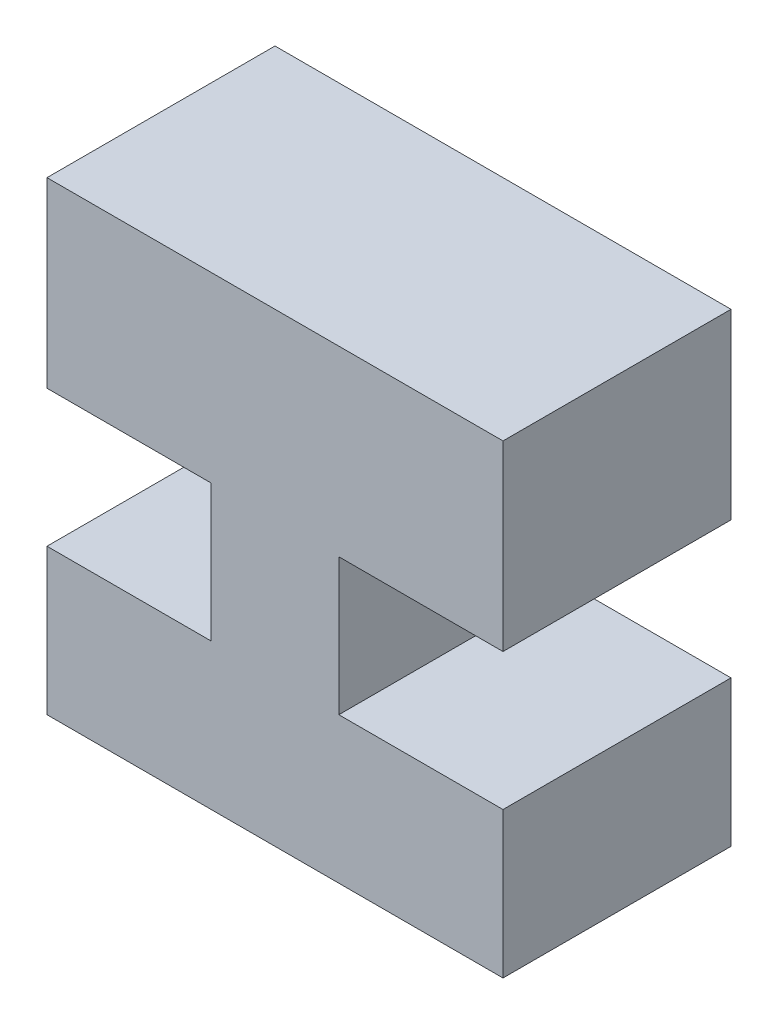
ISO-10303-21;
HEADER;
FILE_DESCRIPTION(('STEP AP214'),'2;1');
FILE_NAME('part.step','',(''),(''),'','','');
FILE_SCHEMA(('AUTOMOTIVE_DESIGN { 1 0 10303 214 1 1 1 1 }'));
ENDSEC;
DATA;
#1=APPLICATION_CONTEXT('core data for automotive mechanical design processes');
#2=APPLICATION_PROTOCOL_DEFINITION('international standard','automotive_design',2000,#1);
#3=PRODUCT_CONTEXT('',#1,'mechanical');
#4=PRODUCT('Part','Part','',(#3));
#5=PRODUCT_RELATED_PRODUCT_CATEGORY('part','',(#4));
#6=PRODUCT_DEFINITION_FORMATION('','',#4);
#7=PRODUCT_DEFINITION_CONTEXT('part definition',#1,'design');
#8=PRODUCT_DEFINITION('design','',#6,#7);
#9=PRODUCT_DEFINITION_SHAPE('','',#8);
#10=(LENGTH_UNIT() NAMED_UNIT(*) SI_UNIT(.MILLI.,.METRE.));
#11=(NAMED_UNIT(*) PLANE_ANGLE_UNIT() SI_UNIT($,.RADIAN.));
#12=(NAMED_UNIT(*) SI_UNIT($,.STERADIAN.) SOLID_ANGLE_UNIT());
#13=UNCERTAINTY_MEASURE_WITH_UNIT(LENGTH_MEASURE(1.E-05),#10,'distance_accuracy_value','');
#14=(GEOMETRIC_REPRESENTATION_CONTEXT(3) GLOBAL_UNCERTAINTY_ASSIGNED_CONTEXT((#13)) GLOBAL_UNIT_ASSIGNED_CONTEXT((#10,
#11,#12)) REPRESENTATION_CONTEXT('',''));
#15=CARTESIAN_POINT('',(0.,0.,0.));
#16=DIRECTION('',(0.,0.,1.));
#17=DIRECTION('',(1.,0.,0.));
#18=AXIS2_PLACEMENT_3D('',#15,#16,#17);
#19=CARTESIAN_POINT('',(12.7,-12.954,6.35));
#20=DIRECTION('',(0.,1.,0.));
#21=DIRECTION('',(0.,0.,1.));
#22=AXIS2_PLACEMENT_3D('',#19,#20,#21);
#23=PLANE('',#22);
#24=CARTESIAN_POINT('',(6.35,-12.954,3.175));
#25=DIRECTION('',(0.,1.,0.));
#26=DIRECTION('',(0.,0.,1.));
#27=AXIS2_PLACEMENT_3D('',#24,#25,#26);
#28=CIRCLE('',#27,2.37716033165933);
#29=CARTESIAN_POINT('',(6.35,-12.954,5.55216033165933));
#30=VERTEX_POINT('',#29);
#31=EDGE_CURVE('E11',#30,#30,#28,.T.);
#32=ORIENTED_EDGE('',*,*,#31,.T.);
#33=EDGE_LOOP('',(#32));
#34=FACE_BOUND('',#33,.T.);
#35=DIRECTION('',(1.,0.,0.));
#36=VECTOR('',#35,1.);
#37=CARTESIAN_POINT('',(12.7,-12.954,0.));
#38=LINE('',#37,#36);
#39=CARTESIAN_POINT('',(0.,-12.954,0.));
#40=VERTEX_POINT('',#39);
#41=CARTESIAN_POINT('',(12.7,-12.954,0.));
#42=VERTEX_POINT('',#41);
#43=EDGE_CURVE('E166',#40,#42,#38,.T.);
#44=ORIENTED_EDGE('',*,*,#43,.T.);
#45=DIRECTION('',(0.,0.,-1.));
#46=VECTOR('',#45,1.);
#47=CARTESIAN_POINT('',(12.7,-12.954,6.35));
#48=LINE('',#47,#46);
#49=CARTESIAN_POINT('',(12.7,-12.954,6.35));
#50=VERTEX_POINT('',#49);
#51=EDGE_CURVE('E187',#50,#42,#48,.T.);
#52=ORIENTED_EDGE('',*,*,#51,.F.);
#53=DIRECTION('',(1.,0.,0.));
#54=VECTOR('',#53,1.);
#55=CARTESIAN_POINT('',(12.7,-12.954,6.35));
#56=LINE('',#55,#54);
#57=CARTESIAN_POINT('',(0.,-12.954,6.35));
#58=VERTEX_POINT('',#57);
#59=EDGE_CURVE('E225',#58,#50,#56,.T.);
#60=ORIENTED_EDGE('',*,*,#59,.F.);
#61=DIRECTION('',(0.,0.,-1.));
#62=VECTOR('',#61,1.);
#63=CARTESIAN_POINT('',(0.,-12.954,6.35));
#64=LINE('',#63,#62);
#65=EDGE_CURVE('E190',#58,#40,#64,.T.);
#66=ORIENTED_EDGE('',*,*,#65,.T.);
#67=EDGE_LOOP('',(#44,#52,#60,#66));
#68=FACE_BOUND('',#67,.T.);
#69=ADVANCED_FACE('F32',(#34,#68),#23,.F.);
#70=CARTESIAN_POINT('',(0.,-5.08,6.35));
#71=DIRECTION('',(1.,0.,0.));
#72=DIRECTION('',(0.,0.,-1.));
#73=AXIS2_PLACEMENT_3D('',#70,#71,#72);
#74=PLANE('',#73);
#75=DIRECTION('',(0.,-1.,0.));
#76=VECTOR('',#75,1.);
#77=CARTESIAN_POINT('',(0.,-5.08,0.));
#78=LINE('',#77,#76);
#79=CARTESIAN_POINT('',(0.,0.,0.));
#80=VERTEX_POINT('',#79);
#81=CARTESIAN_POINT('',(0.,-5.08,0.));
#82=VERTEX_POINT('',#81);
#83=EDGE_CURVE('E154',#80,#82,#78,.T.);
#84=ORIENTED_EDGE('',*,*,#83,.T.);
#85=DIRECTION('',(0.,0.,-1.));
#86=VECTOR('',#85,1.);
#87=CARTESIAN_POINT('',(0.,-5.08,6.35));
#88=LINE('',#87,#86);
#89=CARTESIAN_POINT('',(0.,-5.08,6.35));
#90=VERTEX_POINT('',#89);
#91=EDGE_CURVE('E41',#90,#82,#88,.T.);
#92=ORIENTED_EDGE('',*,*,#91,.F.);
#93=DIRECTION('',(0.,-1.,0.));
#94=VECTOR('',#93,1.);
#95=CARTESIAN_POINT('',(0.,-5.08,6.35));
#96=LINE('',#95,#94);
#97=CARTESIAN_POINT('',(0.,0.,6.35));
#98=VERTEX_POINT('',#97);
#99=EDGE_CURVE('E177',#98,#90,#96,.T.);
#100=ORIENTED_EDGE('',*,*,#99,.F.);
#101=DIRECTION('',(0.,0.,-1.));
#102=VECTOR('',#101,1.);
#103=CARTESIAN_POINT('',(0.,0.,6.35));
#104=LINE('',#103,#102);
#105=EDGE_CURVE('E150',#98,#80,#104,.T.);
#106=ORIENTED_EDGE('',*,*,#105,.T.);
#107=EDGE_LOOP('',(#84,#92,#100,#106));
#108=FACE_BOUND('',#107,.T.);
#109=ADVANCED_FACE('F206',(#108),#74,.F.);
#110=CARTESIAN_POINT('',(4.572,-5.08,6.35));
#111=DIRECTION('',(0.,1.,0.));
#112=DIRECTION('',(-1.,0.,0.));
#113=AXIS2_PLACEMENT_3D('',#110,#111,#112);
#114=PLANE('',#113);
#115=DIRECTION('',(1.,0.,0.));
#116=VECTOR('',#115,1.);
#117=CARTESIAN_POINT('',(4.572,-5.08,0.));
#118=LINE('',#117,#116);
#119=CARTESIAN_POINT('',(4.572,-5.08,0.));
#120=VERTEX_POINT('',#119);
#121=EDGE_CURVE('E157',#82,#120,#118,.T.);
#122=ORIENTED_EDGE('',*,*,#121,.T.);
#123=DIRECTION('',(0.,0.,-1.));
#124=VECTOR('',#123,1.);
#125=CARTESIAN_POINT('',(4.572,-5.08,6.35));
#126=LINE('',#125,#124);
#127=CARTESIAN_POINT('',(4.572,-5.08,6.35));
#128=VERTEX_POINT('',#127);
#129=EDGE_CURVE('E199',#128,#120,#126,.T.);
#130=ORIENTED_EDGE('',*,*,#129,.F.);
#131=DIRECTION('',(1.,0.,0.));
#132=VECTOR('',#131,1.);
#133=CARTESIAN_POINT('',(4.572,-5.08,6.35));
#134=LINE('',#133,#132);
#135=EDGE_CURVE('E105',#90,#128,#134,.T.);
#136=ORIENTED_EDGE('',*,*,#135,.F.);
#137=ORIENTED_EDGE('',*,*,#91,.T.);
#138=EDGE_LOOP('',(#122,#130,#136,#137));
#139=FACE_BOUND('',#138,.T.);
#140=ADVANCED_FACE('F202',(#139),#114,.F.);
#141=CARTESIAN_POINT('',(4.572,-8.89,6.35));
#142=DIRECTION('',(1.,0.,0.));
#143=DIRECTION('',(0.,0.,-1.));
#144=AXIS2_PLACEMENT_3D('',#141,#142,#143);
#145=PLANE('',#144);
#146=DIRECTION('',(0.,-1.,0.));
#147=VECTOR('',#146,1.);
#148=CARTESIAN_POINT('',(4.572,-8.89,0.));
#149=LINE('',#148,#147);
#150=CARTESIAN_POINT('',(4.572,-8.89,0.));
#151=VERTEX_POINT('',#150);
#152=EDGE_CURVE('E160',#120,#151,#149,.T.);
#153=ORIENTED_EDGE('',*,*,#152,.T.);
#154=DIRECTION('',(0.,0.,-1.));
#155=VECTOR('',#154,1.);
#156=CARTESIAN_POINT('',(4.572,-8.89,6.35));
#157=LINE('',#156,#155);
#158=CARTESIAN_POINT('',(4.572,-8.89,6.35));
#159=VERTEX_POINT('',#158);
#160=EDGE_CURVE('E196',#159,#151,#157,.T.);
#161=ORIENTED_EDGE('',*,*,#160,.F.);
#162=DIRECTION('',(0.,-1.,0.));
#163=VECTOR('',#162,1.);
#164=CARTESIAN_POINT('',(4.572,-8.89,6.35));
#165=LINE('',#164,#163);
#166=EDGE_CURVE('E223',#128,#159,#165,.T.);
#167=ORIENTED_EDGE('',*,*,#166,.F.);
#168=ORIENTED_EDGE('',*,*,#129,.T.);
#169=EDGE_LOOP('',(#153,#161,#167,#168));
#170=FACE_BOUND('',#169,.T.);
#171=ADVANCED_FACE('F214',(#170),#145,.F.);
#172=CARTESIAN_POINT('',(0.,-8.89,6.35));
#173=DIRECTION('',(0.,-1.,0.));
#174=DIRECTION('',(0.,0.,-1.));
#175=AXIS2_PLACEMENT_3D('',#172,#173,#174);
#176=PLANE('',#175);
#177=DIRECTION('',(-1.,0.,0.));
#178=VECTOR('',#177,1.);
#179=CARTESIAN_POINT('',(0.,-8.89,0.));
#180=LINE('',#179,#178);
#181=CARTESIAN_POINT('',(0.,-8.89,0.));
#182=VERTEX_POINT('',#181);
#183=EDGE_CURVE('E162',#151,#182,#180,.T.);
#184=ORIENTED_EDGE('',*,*,#183,.T.);
#185=DIRECTION('',(0.,0.,-1.));
#186=VECTOR('',#185,1.);
#187=CARTESIAN_POINT('',(0.,-8.89,6.35));
#188=LINE('',#187,#186);
#189=CARTESIAN_POINT('',(0.,-8.89,6.35));
#190=VERTEX_POINT('',#189);
#191=EDGE_CURVE('E193',#190,#182,#188,.T.);
#192=ORIENTED_EDGE('',*,*,#191,.F.);
#193=DIRECTION('',(-1.,0.,0.));
#194=VECTOR('',#193,1.);
#195=CARTESIAN_POINT('',(0.,-8.89,6.35));
#196=LINE('',#195,#194);
#197=EDGE_CURVE('E220',#159,#190,#196,.T.);
#198=ORIENTED_EDGE('',*,*,#197,.F.);
#199=ORIENTED_EDGE('',*,*,#160,.T.);
#200=EDGE_LOOP('',(#184,#192,#198,#199));
#201=FACE_BOUND('',#200,.T.);
#202=ADVANCED_FACE('F218',(#201),#176,.F.);
#203=CARTESIAN_POINT('',(0.,-12.954,6.35));
#204=DIRECTION('',(1.,0.,0.));
#205=DIRECTION('',(0.,1.,0.));
#206=AXIS2_PLACEMENT_3D('',#203,#204,#205);
#207=PLANE('',#206);
#208=DIRECTION('',(0.,-1.,0.));
#209=VECTOR('',#208,1.);
#210=CARTESIAN_POINT('',(0.,-12.954,0.));
#211=LINE('',#210,#209);
#212=EDGE_CURVE('E164',#182,#40,#211,.T.);
#213=ORIENTED_EDGE('',*,*,#212,.T.);
#214=ORIENTED_EDGE('',*,*,#65,.F.);
#215=DIRECTION('',(0.,-1.,0.));
#216=VECTOR('',#215,1.);
#217=CARTESIAN_POINT('',(0.,-12.954,6.35));
#218=LINE('',#217,#216);
#219=EDGE_CURVE('E222',#190,#58,#218,.T.);
#220=ORIENTED_EDGE('',*,*,#219,.F.);
#221=ORIENTED_EDGE('',*,*,#191,.T.);
#222=EDGE_LOOP('',(#213,#214,#220,#221));
#223=FACE_BOUND('',#222,.T.);
#224=ADVANCED_FACE('F253',(#223),#207,.F.);
#225=CARTESIAN_POINT('',(12.7,-8.89,6.35));
#226=DIRECTION('',(-1.,0.,0.));
#227=DIRECTION('',(0.,-1.,0.));
#228=AXIS2_PLACEMENT_3D('',#225,#226,#227);
#229=PLANE('',#228);
#230=DIRECTION('',(0.,1.,0.));
#231=VECTOR('',#230,1.);
#232=CARTESIAN_POINT('',(12.7,-8.89,0.));
#233=LINE('',#232,#231);
#234=CARTESIAN_POINT('',(12.7,-8.89,0.));
#235=VERTEX_POINT('',#234);
#236=EDGE_CURVE('E168',#42,#235,#233,.T.);
#237=ORIENTED_EDGE('',*,*,#236,.T.);
#238=DIRECTION('',(0.,0.,-1.));
#239=VECTOR('',#238,1.);
#240=CARTESIAN_POINT('',(12.7,-8.89,6.35));
#241=LINE('',#240,#239);
#242=CARTESIAN_POINT('',(12.7,-8.89,6.35));
#243=VERTEX_POINT('',#242);
#244=EDGE_CURVE('E184',#243,#235,#241,.T.);
#245=ORIENTED_EDGE('',*,*,#244,.F.);
#246=DIRECTION('',(0.,1.,0.));
#247=VECTOR('',#246,1.);
#248=CARTESIAN_POINT('',(12.7,-8.89,6.35));
#249=LINE('',#248,#247);
#250=EDGE_CURVE('E231',#50,#243,#249,.T.);
#251=ORIENTED_EDGE('',*,*,#250,.F.);
#252=ORIENTED_EDGE('',*,*,#51,.T.);
#253=EDGE_LOOP('',(#237,#245,#251,#252));
#254=FACE_BOUND('',#253,.T.);
#255=ADVANCED_FACE('F247',(#254),#229,.F.);
#256=CARTESIAN_POINT('',(8.128,-8.89,6.35));
#257=DIRECTION('',(0.,-1.,0.));
#258=DIRECTION('',(0.,0.,-1.));
#259=AXIS2_PLACEMENT_3D('',#256,#257,#258);
#260=PLANE('',#259);
#261=DIRECTION('',(-1.,0.,0.));
#262=VECTOR('',#261,1.);
#263=CARTESIAN_POINT('',(8.128,-8.89,0.));
#264=LINE('',#263,#262);
#265=CARTESIAN_POINT('',(8.128,-8.89,0.));
#266=VERTEX_POINT('',#265);
#267=EDGE_CURVE('E170',#235,#266,#264,.T.);
#268=ORIENTED_EDGE('',*,*,#267,.T.);
#269=DIRECTION('',(0.,0.,-1.));
#270=VECTOR('',#269,1.);
#271=CARTESIAN_POINT('',(8.128,-8.89,6.35));
#272=LINE('',#271,#270);
#273=CARTESIAN_POINT('',(8.128,-8.89,6.35));
#274=VERTEX_POINT('',#273);
#275=EDGE_CURVE('E181',#274,#266,#272,.T.);
#276=ORIENTED_EDGE('',*,*,#275,.F.);
#277=DIRECTION('',(-1.,0.,0.));
#278=VECTOR('',#277,1.);
#279=CARTESIAN_POINT('',(8.128,-8.89,6.35));
#280=LINE('',#279,#278);
#281=EDGE_CURVE('E233',#243,#274,#280,.T.);
#282=ORIENTED_EDGE('',*,*,#281,.F.);
#283=ORIENTED_EDGE('',*,*,#244,.T.);
#284=EDGE_LOOP('',(#268,#276,#282,#283));
#285=FACE_BOUND('',#284,.T.);
#286=ADVANCED_FACE('F239',(#285),#260,.F.);
#287=CARTESIAN_POINT('',(8.128,-5.08,6.35));
#288=DIRECTION('',(-1.,0.,0.));
#289=DIRECTION('',(0.,0.,1.));
#290=AXIS2_PLACEMENT_3D('',#287,#288,#289);
#291=PLANE('',#290);
#292=DIRECTION('',(0.,1.,0.));
#293=VECTOR('',#292,1.);
#294=CARTESIAN_POINT('',(8.128,-5.08,0.));
#295=LINE('',#294,#293);
#296=CARTESIAN_POINT('',(8.128,-5.08,0.));
#297=VERTEX_POINT('',#296);
#298=EDGE_CURVE('E172',#266,#297,#295,.T.);
#299=ORIENTED_EDGE('',*,*,#298,.T.);
#300=DIRECTION('',(0.,0.,-1.));
#301=VECTOR('',#300,1.);
#302=CARTESIAN_POINT('',(8.128,-5.08,6.35));
#303=LINE('',#302,#301);
#304=CARTESIAN_POINT('',(8.128,-5.08,6.35));
#305=VERTEX_POINT('',#304);
#306=EDGE_CURVE('E145',#305,#297,#303,.T.);
#307=ORIENTED_EDGE('',*,*,#306,.F.);
#308=DIRECTION('',(0.,1.,0.));
#309=VECTOR('',#308,1.);
#310=CARTESIAN_POINT('',(8.128,-5.08,6.35));
#311=LINE('',#310,#309);
#312=EDGE_CURVE('E136',#274,#305,#311,.T.);
#313=ORIENTED_EDGE('',*,*,#312,.F.);
#314=ORIENTED_EDGE('',*,*,#275,.T.);
#315=EDGE_LOOP('',(#299,#307,#313,#314));
#316=FACE_BOUND('',#315,.T.);
#317=ADVANCED_FACE('F243',(#316),#291,.F.);
#318=CARTESIAN_POINT('',(12.7,-5.08,6.35));
#319=DIRECTION('',(0.,1.,0.));
#320=DIRECTION('',(-1.,0.,0.));
#321=AXIS2_PLACEMENT_3D('',#318,#319,#320);
#322=PLANE('',#321);
#323=DIRECTION('',(1.,0.,0.));
#324=VECTOR('',#323,1.);
#325=CARTESIAN_POINT('',(12.7,-5.08,0.));
#326=LINE('',#325,#324);
#327=CARTESIAN_POINT('',(12.7,-5.08,0.));
#328=VERTEX_POINT('',#327);
#329=EDGE_CURVE('E144',#297,#328,#326,.T.);
#330=ORIENTED_EDGE('',*,*,#329,.T.);
#331=DIRECTION('',(0.,0.,-1.));
#332=VECTOR('',#331,1.);
#333=CARTESIAN_POINT('',(12.7,-5.08,6.35));
#334=LINE('',#333,#332);
#335=CARTESIAN_POINT('',(12.7,-5.08,6.35));
#336=VERTEX_POINT('',#335);
#337=EDGE_CURVE('E141',#336,#328,#334,.T.);
#338=ORIENTED_EDGE('',*,*,#337,.F.);
#339=DIRECTION('',(1.,0.,0.));
#340=VECTOR('',#339,1.);
#341=CARTESIAN_POINT('',(12.7,-5.08,6.35));
#342=LINE('',#341,#340);
#343=EDGE_CURVE('E130',#305,#336,#342,.T.);
#344=ORIENTED_EDGE('',*,*,#343,.F.);
#345=ORIENTED_EDGE('',*,*,#306,.T.);
#346=EDGE_LOOP('',(#330,#338,#344,#345));
#347=FACE_BOUND('',#346,.T.);
#348=ADVANCED_FACE('F142',(#347),#322,.F.);
#349=CARTESIAN_POINT('',(12.7,0.,6.35));
#350=DIRECTION('',(-1.,0.,0.));
#351=DIRECTION('',(0.,0.,1.));
#352=AXIS2_PLACEMENT_3D('',#349,#350,#351);
#353=PLANE('',#352);
#354=DIRECTION('',(0.,1.,0.));
#355=VECTOR('',#354,1.);
#356=CARTESIAN_POINT('',(12.7,0.,0.));
#357=LINE('',#356,#355);
#358=CARTESIAN_POINT('',(12.7,0.,0.));
#359=VERTEX_POINT('',#358);
#360=EDGE_CURVE('E90',#328,#359,#357,.T.);
#361=ORIENTED_EDGE('',*,*,#360,.T.);
#362=DIRECTION('',(0.,0.,-1.));
#363=VECTOR('',#362,1.);
#364=CARTESIAN_POINT('',(12.7,0.,6.35));
#365=LINE('',#364,#363);
#366=CARTESIAN_POINT('',(12.7,0.,6.35));
#367=VERTEX_POINT('',#366);
#368=EDGE_CURVE('E146',#367,#359,#365,.T.);
#369=ORIENTED_EDGE('',*,*,#368,.F.);
#370=DIRECTION('',(0.,1.,0.));
#371=VECTOR('',#370,1.);
#372=CARTESIAN_POINT('',(12.7,0.,6.35));
#373=LINE('',#372,#371);
#374=EDGE_CURVE('E134',#336,#367,#373,.T.);
#375=ORIENTED_EDGE('',*,*,#374,.F.);
#376=ORIENTED_EDGE('',*,*,#337,.T.);
#377=EDGE_LOOP('',(#361,#369,#375,#376));
#378=FACE_BOUND('',#377,.T.);
#379=ADVANCED_FACE('F148',(#378),#353,.F.);
#380=CARTESIAN_POINT('',(0.,0.,6.35));
#381=DIRECTION('',(0.,-1.,0.));
#382=DIRECTION('',(0.,0.,-1.));
#383=AXIS2_PLACEMENT_3D('',#380,#381,#382);
#384=PLANE('',#383);
#385=DIRECTION('',(-1.,0.,0.));
#386=VECTOR('',#385,1.);
#387=CARTESIAN_POINT('',(0.,0.,0.));
#388=LINE('',#387,#386);
#389=EDGE_CURVE('E96',#359,#80,#388,.T.);
#390=ORIENTED_EDGE('',*,*,#389,.T.);
#391=ORIENTED_EDGE('',*,*,#105,.F.);
#392=DIRECTION('',(-1.,0.,0.));
#393=VECTOR('',#392,1.);
#394=CARTESIAN_POINT('',(0.,0.,6.35));
#395=LINE('',#394,#393);
#396=EDGE_CURVE('E49',#367,#98,#395,.T.);
#397=ORIENTED_EDGE('',*,*,#396,.F.);
#398=ORIENTED_EDGE('',*,*,#368,.T.);
#399=EDGE_LOOP('',(#390,#391,#397,#398));
#400=FACE_BOUND('',#399,.T.);
#401=ADVANCED_FACE('F277',(#400),#384,.F.);
#402=CARTESIAN_POINT('',(0.,0.,6.35));
#403=DIRECTION('',(0.,0.,-1.));
#404=DIRECTION('',(-1.,0.,0.));
#405=AXIS2_PLACEMENT_3D('',#402,#403,#404);
#406=PLANE('',#405);
#407=ORIENTED_EDGE('',*,*,#99,.T.);
#408=ORIENTED_EDGE('',*,*,#135,.T.);
#409=ORIENTED_EDGE('',*,*,#166,.T.);
#410=ORIENTED_EDGE('',*,*,#197,.T.);
#411=ORIENTED_EDGE('',*,*,#219,.T.);
#412=ORIENTED_EDGE('',*,*,#59,.T.);
#413=ORIENTED_EDGE('',*,*,#250,.T.);
#414=ORIENTED_EDGE('',*,*,#281,.T.);
#415=ORIENTED_EDGE('',*,*,#312,.T.);
#416=ORIENTED_EDGE('',*,*,#343,.T.);
#417=ORIENTED_EDGE('',*,*,#374,.T.);
#418=ORIENTED_EDGE('',*,*,#396,.T.);
#419=EDGE_LOOP('',(#407,#408,#409,#410,#411,#412,#413,#414,#415,#416,#417,#418));
#420=FACE_BOUND('',#419,.T.);
#421=ADVANCED_FACE('F132',(#420),#406,.F.);
#422=CARTESIAN_POINT('',(0.,0.,0.));
#423=DIRECTION('',(0.,0.,-1.));
#424=DIRECTION('',(-1.,0.,0.));
#425=AXIS2_PLACEMENT_3D('',#422,#423,#424);
#426=PLANE('',#425);
#427=ORIENTED_EDGE('',*,*,#83,.F.);
#428=ORIENTED_EDGE('',*,*,#389,.F.);
#429=ORIENTED_EDGE('',*,*,#360,.F.);
#430=ORIENTED_EDGE('',*,*,#329,.F.);
#431=ORIENTED_EDGE('',*,*,#298,.F.);
#432=ORIENTED_EDGE('',*,*,#267,.F.);
#433=ORIENTED_EDGE('',*,*,#236,.F.);
#434=ORIENTED_EDGE('',*,*,#43,.F.);
#435=ORIENTED_EDGE('',*,*,#212,.F.);
#436=ORIENTED_EDGE('',*,*,#183,.F.);
#437=ORIENTED_EDGE('',*,*,#152,.F.);
#438=ORIENTED_EDGE('',*,*,#121,.F.);
#439=EDGE_LOOP('',(#427,#428,#429,#430,#431,#432,#433,#434,#435,#436,#437,#438));
#440=FACE_BOUND('',#439,.T.);
#441=ADVANCED_FACE('F208',(#440),#426,.T.);
#442=CARTESIAN_POINT('',(6.35,-13.208,3.175));
#443=DIRECTION('',(0.,-1.,0.));
#444=DIRECTION('',(0.,0.,-1.));
#445=AXIS2_PLACEMENT_3D('',#442,#443,#444);
#446=PLANE('',#445);
#447=CARTESIAN_POINT('',(6.35,-13.208,3.175));
#448=DIRECTION('',(0.,-1.,0.));
#449=DIRECTION('',(0.,0.,-1.));
#450=AXIS2_PLACEMENT_3D('',#447,#448,#449);
#451=CIRCLE('',#450,1.27);
#452=CARTESIAN_POINT('',(6.35,-13.208,1.905));
#453=VERTEX_POINT('',#452);
#454=EDGE_CURVE('E158',#453,#453,#451,.T.);
#455=ORIENTED_EDGE('',*,*,#454,.T.);
#456=EDGE_LOOP('',(#455));
#457=FACE_BOUND('',#456,.T.);
#458=ADVANCED_FACE('F282',(#457),#446,.T.);
#459=CARTESIAN_POINT('',(6.35,-15.494,3.175));
#460=DIRECTION('',(0.,1.,0.));
#461=DIRECTION('',(0.,0.,1.));
#462=AXIS2_PLACEMENT_3D('',#459,#460,#461);
#463=DEGENERATE_TOROIDAL_SURFACE('',#462,2.37716033165933,2.54,.T.);
#464=ORIENTED_EDGE('',*,*,#31,.F.);
#465=EDGE_LOOP('',(#464));
#466=FACE_BOUND('',#465,.T.);
#467=ORIENTED_EDGE('',*,*,#454,.F.);
#468=EDGE_LOOP('',(#467));
#469=FACE_BOUND('',#468,.T.);
#470=ADVANCED_FACE('F34',(#466,#469),#463,.F.);
#471=CLOSED_SHELL('',(#69,#109,#140,#171,#202,#224,#255,#286,#317,#348,#379,#401,#421,#441,#458,#470));
#472=MANIFOLD_SOLID_BREP('B2',#471);
#473=ADVANCED_BREP_SHAPE_REPRESENTATION('',(#18,#472),#14);
#474=SHAPE_DEFINITION_REPRESENTATION(#9,#473);
ENDSEC;
END-ISO-10303-21;
